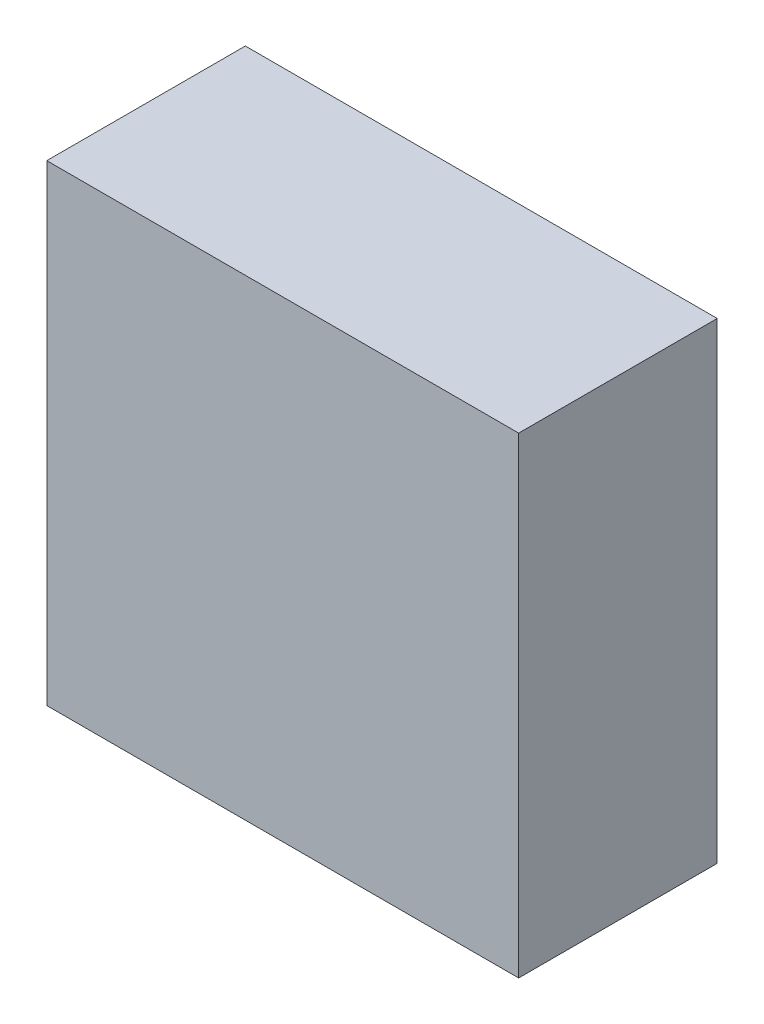
ISO-10303-21;
HEADER;
FILE_DESCRIPTION(('STEP AP214'),'2;1');
FILE_NAME('part.step','',(''),(''),'','','');
FILE_SCHEMA(('AUTOMOTIVE_DESIGN { 1 0 10303 214 1 1 1 1 }'));
ENDSEC;
DATA;
#1=APPLICATION_CONTEXT('core data for automotive mechanical design processes');
#2=APPLICATION_PROTOCOL_DEFINITION('international standard','automotive_design',2000,#1);
#3=PRODUCT_CONTEXT('',#1,'mechanical');
#4=PRODUCT('Part','Part','',(#3));
#5=PRODUCT_RELATED_PRODUCT_CATEGORY('part','',(#4));
#6=PRODUCT_DEFINITION_FORMATION('','',#4);
#7=PRODUCT_DEFINITION_CONTEXT('part definition',#1,'design');
#8=PRODUCT_DEFINITION('design','',#6,#7);
#9=PRODUCT_DEFINITION_SHAPE('','',#8);
#10=(LENGTH_UNIT() NAMED_UNIT(*) SI_UNIT(.MILLI.,.METRE.));
#11=(NAMED_UNIT(*) PLANE_ANGLE_UNIT() SI_UNIT($,.RADIAN.));
#12=(NAMED_UNIT(*) SI_UNIT($,.STERADIAN.) SOLID_ANGLE_UNIT());
#13=UNCERTAINTY_MEASURE_WITH_UNIT(LENGTH_MEASURE(1.E-05),#10,'distance_accuracy_value','');
#14=(GEOMETRIC_REPRESENTATION_CONTEXT(3) GLOBAL_UNCERTAINTY_ASSIGNED_CONTEXT((#13)) GLOBAL_UNIT_ASSIGNED_CONTEXT((#10,
#11,#12)) REPRESENTATION_CONTEXT('',''));
#15=CARTESIAN_POINT('',(0.,0.,0.));
#16=DIRECTION('',(0.,0.,1.));
#17=DIRECTION('',(1.,0.,0.));
#18=AXIS2_PLACEMENT_3D('',#15,#16,#17);
#19=CARTESIAN_POINT('',(-10.1,10.1,8.5));
#20=DIRECTION('',(1.,0.,0.));
#21=DIRECTION('',(0.,0.,-1.));
#22=AXIS2_PLACEMENT_3D('',#19,#20,#21);
#23=PLANE('',#22);
#24=DIRECTION('',(0.,-1.,0.));
#25=VECTOR('',#24,1.);
#26=CARTESIAN_POINT('',(-10.1,10.1,0.));
#27=LINE('',#26,#25);
#28=CARTESIAN_POINT('',(-10.1,10.1,0.));
#29=VERTEX_POINT('',#28);
#30=CARTESIAN_POINT('',(-10.1,-10.1,0.));
#31=VERTEX_POINT('',#30);
#32=EDGE_CURVE('E96',#29,#31,#27,.T.);
#33=ORIENTED_EDGE('',*,*,#32,.T.);
#34=DIRECTION('',(0.,0.,-1.));
#35=VECTOR('',#34,1.);
#36=CARTESIAN_POINT('',(-10.1,-10.1,8.5));
#37=LINE('',#36,#35);
#38=CARTESIAN_POINT('',(-10.1,-10.1,8.5));
#39=VERTEX_POINT('',#38);
#40=EDGE_CURVE('E11',#39,#31,#37,.T.);
#41=ORIENTED_EDGE('',*,*,#40,.F.);
#42=DIRECTION('',(0.,-1.,0.));
#43=VECTOR('',#42,1.);
#44=CARTESIAN_POINT('',(-10.1,10.1,8.5));
#45=LINE('',#44,#43);
#46=CARTESIAN_POINT('',(-10.1,10.1,8.5));
#47=VERTEX_POINT('',#46);
#48=EDGE_CURVE('E84',#47,#39,#45,.T.);
#49=ORIENTED_EDGE('',*,*,#48,.F.);
#50=DIRECTION('',(0.,0.,-1.));
#51=VECTOR('',#50,1.);
#52=CARTESIAN_POINT('',(-10.1,10.1,8.5));
#53=LINE('',#52,#51);
#54=EDGE_CURVE('E92',#47,#29,#53,.T.);
#55=ORIENTED_EDGE('',*,*,#54,.T.);
#56=EDGE_LOOP('',(#33,#41,#49,#55));
#57=FACE_BOUND('',#56,.T.);
#58=ADVANCED_FACE('F33',(#57),#23,.F.);
#59=CARTESIAN_POINT('',(10.1,-10.1,8.5));
#60=DIRECTION('',(0.,1.,0.));
#61=DIRECTION('',(-1.,0.,0.));
#62=AXIS2_PLACEMENT_3D('',#59,#60,#61);
#63=PLANE('',#62);
#64=DIRECTION('',(1.,0.,0.));
#65=VECTOR('',#64,1.);
#66=CARTESIAN_POINT('',(10.1,-10.1,0.));
#67=LINE('',#66,#65);
#68=CARTESIAN_POINT('',(10.1,-10.1,0.));
#69=VERTEX_POINT('',#68);
#70=EDGE_CURVE('E88',#31,#69,#67,.T.);
#71=ORIENTED_EDGE('',*,*,#70,.T.);
#72=DIRECTION('',(0.,0.,-1.));
#73=VECTOR('',#72,1.);
#74=CARTESIAN_POINT('',(10.1,-10.1,8.5));
#75=LINE('',#74,#73);
#76=CARTESIAN_POINT('',(10.1,-10.1,8.5));
#77=VERTEX_POINT('',#76);
#78=EDGE_CURVE('E41',#77,#69,#75,.T.);
#79=ORIENTED_EDGE('',*,*,#78,.F.);
#80=DIRECTION('',(1.,0.,0.));
#81=VECTOR('',#80,1.);
#82=CARTESIAN_POINT('',(10.1,-10.1,8.5));
#83=LINE('',#82,#81);
#84=EDGE_CURVE('E79',#39,#77,#83,.T.);
#85=ORIENTED_EDGE('',*,*,#84,.F.);
#86=ORIENTED_EDGE('',*,*,#40,.T.);
#87=EDGE_LOOP('',(#71,#79,#85,#86));
#88=FACE_BOUND('',#87,.T.);
#89=ADVANCED_FACE('F87',(#88),#63,.F.);
#90=CARTESIAN_POINT('',(10.1,10.1,8.5));
#91=DIRECTION('',(-1.,0.,0.));
#92=DIRECTION('',(0.,-1.,0.));
#93=AXIS2_PLACEMENT_3D('',#90,#91,#92);
#94=PLANE('',#93);
#95=DIRECTION('',(0.,1.,0.));
#96=VECTOR('',#95,1.);
#97=CARTESIAN_POINT('',(10.1,10.1,0.));
#98=LINE('',#97,#96);
#99=CARTESIAN_POINT('',(10.1,10.1,0.));
#100=VERTEX_POINT('',#99);
#101=EDGE_CURVE('E66',#69,#100,#98,.T.);
#102=ORIENTED_EDGE('',*,*,#101,.T.);
#103=DIRECTION('',(0.,0.,-1.));
#104=VECTOR('',#103,1.);
#105=CARTESIAN_POINT('',(10.1,10.1,8.5));
#106=LINE('',#105,#104);
#107=CARTESIAN_POINT('',(10.1,10.1,8.5));
#108=VERTEX_POINT('',#107);
#109=EDGE_CURVE('E89',#108,#100,#106,.T.);
#110=ORIENTED_EDGE('',*,*,#109,.F.);
#111=DIRECTION('',(0.,1.,0.));
#112=VECTOR('',#111,1.);
#113=CARTESIAN_POINT('',(10.1,10.1,8.5));
#114=LINE('',#113,#112);
#115=EDGE_CURVE('E82',#77,#108,#114,.T.);
#116=ORIENTED_EDGE('',*,*,#115,.F.);
#117=ORIENTED_EDGE('',*,*,#78,.T.);
#118=EDGE_LOOP('',(#102,#110,#116,#117));
#119=FACE_BOUND('',#118,.T.);
#120=ADVANCED_FACE('F90',(#119),#94,.F.);
#121=CARTESIAN_POINT('',(10.1,10.1,8.5));
#122=DIRECTION('',(0.,-1.,0.));
#123=DIRECTION('',(1.,0.,0.));
#124=AXIS2_PLACEMENT_3D('',#121,#122,#123);
#125=PLANE('',#124);
#126=DIRECTION('',(-1.,0.,0.));
#127=VECTOR('',#126,1.);
#128=CARTESIAN_POINT('',(10.1,10.1,0.));
#129=LINE('',#128,#127);
#130=EDGE_CURVE('E72',#100,#29,#129,.T.);
#131=ORIENTED_EDGE('',*,*,#130,.T.);
#132=ORIENTED_EDGE('',*,*,#54,.F.);
#133=DIRECTION('',(-1.,0.,0.));
#134=VECTOR('',#133,1.);
#135=CARTESIAN_POINT('',(10.1,10.1,8.5));
#136=LINE('',#135,#134);
#137=EDGE_CURVE('E49',#108,#47,#136,.T.);
#138=ORIENTED_EDGE('',*,*,#137,.F.);
#139=ORIENTED_EDGE('',*,*,#109,.T.);
#140=EDGE_LOOP('',(#131,#132,#138,#139));
#141=FACE_BOUND('',#140,.T.);
#142=ADVANCED_FACE('F103',(#141),#125,.F.);
#143=CARTESIAN_POINT('',(0.,0.,8.5));
#144=DIRECTION('',(0.,0.,-1.));
#145=DIRECTION('',(-1.,0.,0.));
#146=AXIS2_PLACEMENT_3D('',#143,#144,#145);
#147=PLANE('',#146);
#148=ORIENTED_EDGE('',*,*,#48,.T.);
#149=ORIENTED_EDGE('',*,*,#84,.T.);
#150=ORIENTED_EDGE('',*,*,#115,.T.);
#151=ORIENTED_EDGE('',*,*,#137,.T.);
#152=EDGE_LOOP('',(#148,#149,#150,#151));
#153=FACE_BOUND('',#152,.T.);
#154=ADVANCED_FACE('F80',(#153),#147,.F.);
#155=CARTESIAN_POINT('',(0.,0.,0.));
#156=DIRECTION('',(0.,0.,-1.));
#157=DIRECTION('',(-1.,0.,0.));
#158=AXIS2_PLACEMENT_3D('',#155,#156,#157);
#159=PLANE('',#158);
#160=ORIENTED_EDGE('',*,*,#32,.F.);
#161=ORIENTED_EDGE('',*,*,#130,.F.);
#162=ORIENTED_EDGE('',*,*,#101,.F.);
#163=ORIENTED_EDGE('',*,*,#70,.F.);
#164=EDGE_LOOP('',(#160,#161,#162,#163));
#165=FACE_BOUND('',#164,.T.);
#166=ADVANCED_FACE('F106',(#165),#159,.T.);
#167=CLOSED_SHELL('',(#58,#89,#120,#142,#154,#166));
#168=MANIFOLD_SOLID_BREP('B2',#167);
#169=ADVANCED_BREP_SHAPE_REPRESENTATION('',(#18,#168),#14);
#170=SHAPE_DEFINITION_REPRESENTATION(#9,#169);
ENDSEC;
END-ISO-10303-21;
